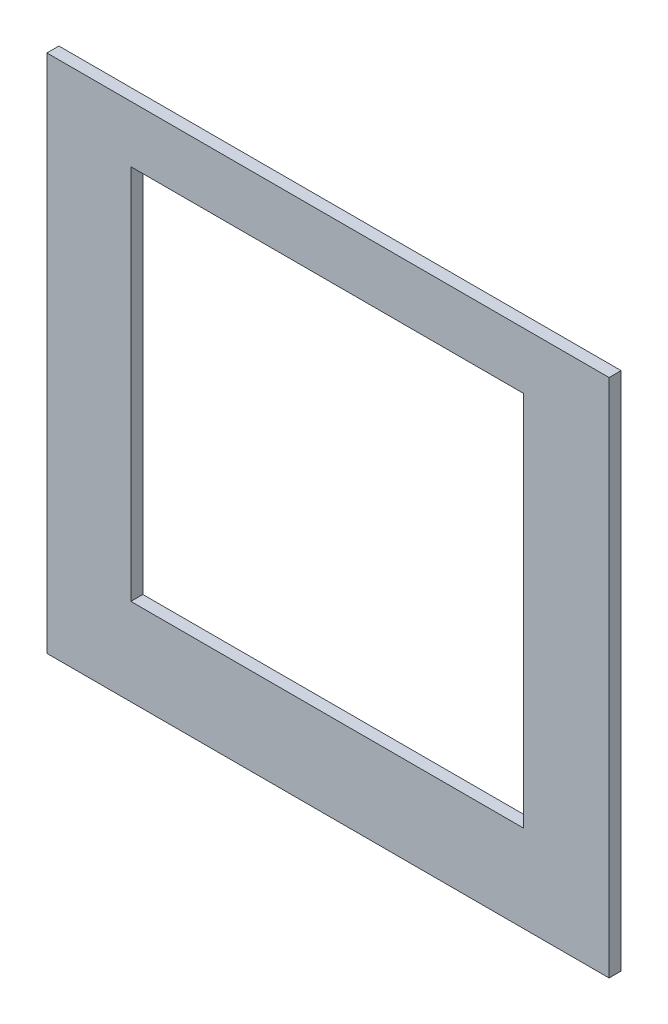
ISO-10303-21;
HEADER;
FILE_DESCRIPTION(('STEP AP214'),'2;1');
FILE_NAME('part.step','',(''),(''),'','','');
FILE_SCHEMA(('AUTOMOTIVE_DESIGN { 1 0 10303 214 1 1 1 1 }'));
ENDSEC;
DATA;
#1=APPLICATION_CONTEXT('core data for automotive mechanical design processes');
#2=APPLICATION_PROTOCOL_DEFINITION('international standard','automotive_design',2000,#1);
#3=PRODUCT_CONTEXT('',#1,'mechanical');
#4=PRODUCT('Part','Part','',(#3));
#5=PRODUCT_RELATED_PRODUCT_CATEGORY('part','',(#4));
#6=PRODUCT_DEFINITION_FORMATION('','',#4);
#7=PRODUCT_DEFINITION_CONTEXT('part definition',#1,'design');
#8=PRODUCT_DEFINITION('design','',#6,#7);
#9=PRODUCT_DEFINITION_SHAPE('','',#8);
#10=(LENGTH_UNIT() NAMED_UNIT(*) SI_UNIT(.MILLI.,.METRE.));
#11=(NAMED_UNIT(*) PLANE_ANGLE_UNIT() SI_UNIT($,.RADIAN.));
#12=(NAMED_UNIT(*) SI_UNIT($,.STERADIAN.) SOLID_ANGLE_UNIT());
#13=UNCERTAINTY_MEASURE_WITH_UNIT(LENGTH_MEASURE(1.E-05),#10,'distance_accuracy_value','');
#14=(GEOMETRIC_REPRESENTATION_CONTEXT(3) GLOBAL_UNCERTAINTY_ASSIGNED_CONTEXT((#13)) GLOBAL_UNIT_ASSIGNED_CONTEXT((#10,
#11,#12)) REPRESENTATION_CONTEXT('',''));
#15=CARTESIAN_POINT('',(0.,0.,0.));
#16=DIRECTION('',(0.,0.,1.));
#17=DIRECTION('',(1.,0.,0.));
#18=AXIS2_PLACEMENT_3D('',#15,#16,#17);
#19=CARTESIAN_POINT('',(0.,0.,19.05));
#20=DIRECTION('',(0.,0.,1.));
#21=DIRECTION('',(1.,0.,0.));
#22=AXIS2_PLACEMENT_3D('',#19,#20,#21);
#23=PLANE('',#22);
#24=DIRECTION('',(0.,-1.,0.));
#25=VECTOR('',#24,1.);
#26=CARTESIAN_POINT('',(1904.50560496076,2801.85767112072,19.05));
#27=LINE('',#26,#25);
#28=CARTESIAN_POINT('',(1904.50560496076,2801.85767112072,19.05));
#29=VERTEX_POINT('',#28);
#30=CARTESIAN_POINT('',(1904.50560496076,1976.35767112072,19.05));
#31=VERTEX_POINT('',#30);
#32=EDGE_CURVE('E134',#29,#31,#27,.T.);
#33=ORIENTED_EDGE('',*,*,#32,.T.);
#34=DIRECTION('',(1.,0.,0.));
#35=VECTOR('',#34,1.);
#36=CARTESIAN_POINT('',(1904.50560496076,1976.35767112072,19.05));
#37=LINE('',#36,#35);
#38=CARTESIAN_POINT('',(2796.96508496076,1976.35767112072,19.05));
#39=VERTEX_POINT('',#38);
#40=EDGE_CURVE('E137',#31,#39,#37,.T.);
#41=ORIENTED_EDGE('',*,*,#40,.T.);
#42=DIRECTION('',(0.,1.,0.));
#43=VECTOR('',#42,1.);
#44=CARTESIAN_POINT('',(2796.96508496076,1976.35767112072,19.05));
#45=LINE('',#44,#43);
#46=CARTESIAN_POINT('',(2796.96508496076,2801.85767112072,19.05));
#47=VERTEX_POINT('',#46);
#48=EDGE_CURVE('E140',#39,#47,#45,.T.);
#49=ORIENTED_EDGE('',*,*,#48,.T.);
#50=DIRECTION('',(-1.,0.,0.));
#51=VECTOR('',#50,1.);
#52=CARTESIAN_POINT('',(2796.96508496076,2801.85767112072,19.05));
#53=LINE('',#52,#51);
#54=EDGE_CURVE('E142',#47,#29,#53,.T.);
#55=ORIENTED_EDGE('',*,*,#54,.T.);
#56=EDGE_LOOP('',(#33,#41,#49,#55));
#57=FACE_BOUND('',#56,.T.);
#58=DIRECTION('',(1.,0.,0.));
#59=VECTOR('',#58,1.);
#60=CARTESIAN_POINT('',(2661.1781320158,2114.49307062371,19.05));
#61=LINE('',#60,#59);
#62=CARTESIAN_POINT('',(2037.74413485327,2114.49307062371,19.05));
#63=VERTEX_POINT('',#62);
#64=CARTESIAN_POINT('',(2661.1781320158,2114.49307062371,19.05));
#65=VERTEX_POINT('',#64);
#66=EDGE_CURVE('E106',#63,#65,#61,.T.);
#67=ORIENTED_EDGE('',*,*,#66,.F.);
#68=DIRECTION('',(0.,-1.,0.));
#69=VECTOR('',#68,1.);
#70=CARTESIAN_POINT('',(2037.74413485327,2114.49307062371,19.05));
#71=LINE('',#70,#69);
#72=CARTESIAN_POINT('',(2037.74413485327,2712.10024123284,19.05));
#73=VERTEX_POINT('',#72);
#74=EDGE_CURVE('E98',#73,#63,#71,.T.);
#75=ORIENTED_EDGE('',*,*,#74,.F.);
#76=DIRECTION('',(-1.,0.,0.));
#77=VECTOR('',#76,1.);
#78=CARTESIAN_POINT('',(2037.74413485327,2712.10024123284,19.05));
#79=LINE('',#78,#77);
#80=CARTESIAN_POINT('',(2661.1781320158,2712.10024123284,19.05));
#81=VERTEX_POINT('',#80);
#82=EDGE_CURVE('E120',#81,#73,#79,.T.);
#83=ORIENTED_EDGE('',*,*,#82,.F.);
#84=DIRECTION('',(0.,1.,0.));
#85=VECTOR('',#84,1.);
#86=CARTESIAN_POINT('',(2661.1781320158,2712.10024123284,19.05));
#87=LINE('',#86,#85);
#88=EDGE_CURVE('E118',#65,#81,#87,.T.);
#89=ORIENTED_EDGE('',*,*,#88,.F.);
#90=EDGE_LOOP('',(#67,#75,#83,#89));
#91=FACE_BOUND('',#90,.T.);
#92=ADVANCED_FACE('F33',(#57,#91),#23,.T.);
#93=CARTESIAN_POINT('',(0.,0.,0.));
#94=DIRECTION('',(0.,0.,1.));
#95=DIRECTION('',(1.,0.,0.));
#96=AXIS2_PLACEMENT_3D('',#93,#94,#95);
#97=PLANE('',#96);
#98=DIRECTION('',(0.,-1.,0.));
#99=VECTOR('',#98,1.);
#100=CARTESIAN_POINT('',(1904.50560496076,2801.85767112072,0.));
#101=LINE('',#100,#99);
#102=CARTESIAN_POINT('',(1904.50560496076,2801.85767112072,0.));
#103=VERTEX_POINT('',#102);
#104=CARTESIAN_POINT('',(1904.50560496076,1976.35767112072,0.));
#105=VERTEX_POINT('',#104);
#106=EDGE_CURVE('E114',#103,#105,#101,.T.);
#107=ORIENTED_EDGE('',*,*,#106,.F.);
#108=DIRECTION('',(-1.,0.,0.));
#109=VECTOR('',#108,1.);
#110=CARTESIAN_POINT('',(2796.96508496076,2801.85767112072,0.));
#111=LINE('',#110,#109);
#112=CARTESIAN_POINT('',(2796.96508496076,2801.85767112072,0.));
#113=VERTEX_POINT('',#112);
#114=EDGE_CURVE('E138',#113,#103,#111,.T.);
#115=ORIENTED_EDGE('',*,*,#114,.F.);
#116=DIRECTION('',(0.,1.,0.));
#117=VECTOR('',#116,1.);
#118=CARTESIAN_POINT('',(2796.96508496076,1976.35767112072,0.));
#119=LINE('',#118,#117);
#120=CARTESIAN_POINT('',(2796.96508496076,1976.35767112072,0.));
#121=VERTEX_POINT('',#120);
#122=EDGE_CURVE('E149',#121,#113,#119,.T.);
#123=ORIENTED_EDGE('',*,*,#122,.F.);
#124=DIRECTION('',(1.,0.,0.));
#125=VECTOR('',#124,1.);
#126=CARTESIAN_POINT('',(1904.50560496076,1976.35767112072,0.));
#127=LINE('',#126,#125);
#128=EDGE_CURVE('E147',#105,#121,#127,.T.);
#129=ORIENTED_EDGE('',*,*,#128,.F.);
#130=EDGE_LOOP('',(#107,#115,#123,#129));
#131=FACE_BOUND('',#130,.T.);
#132=DIRECTION('',(0.,-1.,0.));
#133=VECTOR('',#132,1.);
#134=CARTESIAN_POINT('',(2037.74413485327,2114.49307062371,0.));
#135=LINE('',#134,#133);
#136=CARTESIAN_POINT('',(2037.74413485327,2712.10024123284,0.));
#137=VERTEX_POINT('',#136);
#138=CARTESIAN_POINT('',(2037.74413485327,2114.49307062371,0.));
#139=VERTEX_POINT('',#138);
#140=EDGE_CURVE('E56',#137,#139,#135,.T.);
#141=ORIENTED_EDGE('',*,*,#140,.T.);
#142=DIRECTION('',(1.,0.,0.));
#143=VECTOR('',#142,1.);
#144=CARTESIAN_POINT('',(2661.1781320158,2114.49307062371,0.));
#145=LINE('',#144,#143);
#146=CARTESIAN_POINT('',(2661.1781320158,2114.49307062371,0.));
#147=VERTEX_POINT('',#146);
#148=EDGE_CURVE('E113',#139,#147,#145,.T.);
#149=ORIENTED_EDGE('',*,*,#148,.T.);
#150=DIRECTION('',(0.,1.,0.));
#151=VECTOR('',#150,1.);
#152=CARTESIAN_POINT('',(2661.1781320158,2712.10024123284,0.));
#153=LINE('',#152,#151);
#154=CARTESIAN_POINT('',(2661.1781320158,2712.10024123284,0.));
#155=VERTEX_POINT('',#154);
#156=EDGE_CURVE('E126',#147,#155,#153,.T.);
#157=ORIENTED_EDGE('',*,*,#156,.T.);
#158=DIRECTION('',(-1.,0.,0.));
#159=VECTOR('',#158,1.);
#160=CARTESIAN_POINT('',(2037.74413485327,2712.10024123284,0.));
#161=LINE('',#160,#159);
#162=EDGE_CURVE('E107',#155,#137,#161,.T.);
#163=ORIENTED_EDGE('',*,*,#162,.T.);
#164=EDGE_LOOP('',(#141,#149,#157,#163));
#165=FACE_BOUND('',#164,.T.);
#166=ADVANCED_FACE('F167',(#131,#165),#97,.F.);
#167=CARTESIAN_POINT('',(1904.50560496076,2801.85767112072,19.05));
#168=DIRECTION('',(1.,0.,0.));
#169=DIRECTION('',(0.,0.,-1.));
#170=AXIS2_PLACEMENT_3D('',#167,#168,#169);
#171=PLANE('',#170);
#172=ORIENTED_EDGE('',*,*,#106,.T.);
#173=DIRECTION('',(0.,0.,-1.));
#174=VECTOR('',#173,1.);
#175=CARTESIAN_POINT('',(1904.50560496076,1976.35767112072,19.05));
#176=LINE('',#175,#174);
#177=EDGE_CURVE('E11',#31,#105,#176,.T.);
#178=ORIENTED_EDGE('',*,*,#177,.F.);
#179=ORIENTED_EDGE('',*,*,#32,.F.);
#180=DIRECTION('',(0.,0.,-1.));
#181=VECTOR('',#180,1.);
#182=CARTESIAN_POINT('',(1904.50560496076,2801.85767112072,19.05));
#183=LINE('',#182,#181);
#184=EDGE_CURVE('E144',#29,#103,#183,.T.);
#185=ORIENTED_EDGE('',*,*,#184,.T.);
#186=EDGE_LOOP('',(#172,#178,#179,#185));
#187=FACE_BOUND('',#186,.T.);
#188=ADVANCED_FACE('F35',(#187),#171,.F.);
#189=CARTESIAN_POINT('',(1904.50560496076,1976.35767112072,19.05));
#190=DIRECTION('',(0.,1.,0.));
#191=DIRECTION('',(0.,0.,1.));
#192=AXIS2_PLACEMENT_3D('',#189,#190,#191);
#193=PLANE('',#192);
#194=ORIENTED_EDGE('',*,*,#128,.T.);
#195=DIRECTION('',(0.,0.,-1.));
#196=VECTOR('',#195,1.);
#197=CARTESIAN_POINT('',(2796.96508496076,1976.35767112072,19.05));
#198=LINE('',#197,#196);
#199=EDGE_CURVE('E41',#39,#121,#198,.T.);
#200=ORIENTED_EDGE('',*,*,#199,.F.);
#201=ORIENTED_EDGE('',*,*,#40,.F.);
#202=ORIENTED_EDGE('',*,*,#177,.T.);
#203=EDGE_LOOP('',(#194,#200,#201,#202));
#204=FACE_BOUND('',#203,.T.);
#205=ADVANCED_FACE('F177',(#204),#193,.F.);
#206=CARTESIAN_POINT('',(2796.96508496076,1976.35767112072,19.05));
#207=DIRECTION('',(-1.,0.,0.));
#208=DIRECTION('',(0.,0.,1.));
#209=AXIS2_PLACEMENT_3D('',#206,#207,#208);
#210=PLANE('',#209);
#211=ORIENTED_EDGE('',*,*,#122,.T.);
#212=DIRECTION('',(0.,0.,-1.));
#213=VECTOR('',#212,1.);
#214=CARTESIAN_POINT('',(2796.96508496076,2801.85767112072,19.05));
#215=LINE('',#214,#213);
#216=EDGE_CURVE('E154',#47,#113,#215,.T.);
#217=ORIENTED_EDGE('',*,*,#216,.F.);
#218=ORIENTED_EDGE('',*,*,#48,.F.);
#219=ORIENTED_EDGE('',*,*,#199,.T.);
#220=EDGE_LOOP('',(#211,#217,#218,#219));
#221=FACE_BOUND('',#220,.T.);
#222=ADVANCED_FACE('F161',(#221),#210,.F.);
#223=CARTESIAN_POINT('',(2796.96508496076,2801.85767112072,19.05));
#224=DIRECTION('',(0.,-1.,0.));
#225=DIRECTION('',(0.,0.,-1.));
#226=AXIS2_PLACEMENT_3D('',#223,#224,#225);
#227=PLANE('',#226);
#228=ORIENTED_EDGE('',*,*,#114,.T.);
#229=ORIENTED_EDGE('',*,*,#184,.F.);
#230=ORIENTED_EDGE('',*,*,#54,.F.);
#231=ORIENTED_EDGE('',*,*,#216,.T.);
#232=EDGE_LOOP('',(#228,#229,#230,#231));
#233=FACE_BOUND('',#232,.T.);
#234=ADVANCED_FACE('F171',(#233),#227,.F.);
#235=CARTESIAN_POINT('',(2037.74413485327,2114.49307062371,19.05));
#236=DIRECTION('',(1.,0.,0.));
#237=DIRECTION('',(0.,0.,-1.));
#238=AXIS2_PLACEMENT_3D('',#235,#236,#237);
#239=PLANE('',#238);
#240=ORIENTED_EDGE('',*,*,#140,.F.);
#241=DIRECTION('',(0.,0.,-1.));
#242=VECTOR('',#241,1.);
#243=CARTESIAN_POINT('',(2037.74413485327,2712.10024123284,19.05));
#244=LINE('',#243,#242);
#245=EDGE_CURVE('E102',#73,#137,#244,.T.);
#246=ORIENTED_EDGE('',*,*,#245,.F.);
#247=ORIENTED_EDGE('',*,*,#74,.T.);
#248=DIRECTION('',(0.,0.,-1.));
#249=VECTOR('',#248,1.);
#250=CARTESIAN_POINT('',(2037.74413485327,2114.49307062371,19.05));
#251=LINE('',#250,#249);
#252=EDGE_CURVE('E101',#63,#139,#251,.T.);
#253=ORIENTED_EDGE('',*,*,#252,.T.);
#254=EDGE_LOOP('',(#240,#246,#247,#253));
#255=FACE_BOUND('',#254,.T.);
#256=ADVANCED_FACE('F100',(#255),#239,.T.);
#257=CARTESIAN_POINT('',(2661.1781320158,2114.49307062371,19.05));
#258=DIRECTION('',(0.,1.,0.));
#259=DIRECTION('',(0.,0.,1.));
#260=AXIS2_PLACEMENT_3D('',#257,#258,#259);
#261=PLANE('',#260);
#262=ORIENTED_EDGE('',*,*,#148,.F.);
#263=ORIENTED_EDGE('',*,*,#252,.F.);
#264=ORIENTED_EDGE('',*,*,#66,.T.);
#265=DIRECTION('',(0.,0.,-1.));
#266=VECTOR('',#265,1.);
#267=CARTESIAN_POINT('',(2661.1781320158,2114.49307062371,19.05));
#268=LINE('',#267,#266);
#269=EDGE_CURVE('E115',#65,#147,#268,.T.);
#270=ORIENTED_EDGE('',*,*,#269,.T.);
#271=EDGE_LOOP('',(#262,#263,#264,#270));
#272=FACE_BOUND('',#271,.T.);
#273=ADVANCED_FACE('F110',(#272),#261,.T.);
#274=CARTESIAN_POINT('',(2661.1781320158,2712.10024123284,19.05));
#275=DIRECTION('',(-1.,0.,0.));
#276=DIRECTION('',(0.,0.,1.));
#277=AXIS2_PLACEMENT_3D('',#274,#275,#276);
#278=PLANE('',#277);
#279=ORIENTED_EDGE('',*,*,#156,.F.);
#280=ORIENTED_EDGE('',*,*,#269,.F.);
#281=ORIENTED_EDGE('',*,*,#88,.T.);
#282=DIRECTION('',(0.,0.,-1.));
#283=VECTOR('',#282,1.);
#284=CARTESIAN_POINT('',(2661.1781320158,2712.10024123284,19.05));
#285=LINE('',#284,#283);
#286=EDGE_CURVE('E48',#81,#155,#285,.T.);
#287=ORIENTED_EDGE('',*,*,#286,.T.);
#288=EDGE_LOOP('',(#279,#280,#281,#287));
#289=FACE_BOUND('',#288,.T.);
#290=ADVANCED_FACE('F200',(#289),#278,.T.);
#291=CARTESIAN_POINT('',(2037.74413485327,2712.10024123284,19.05));
#292=DIRECTION('',(0.,-1.,0.));
#293=DIRECTION('',(0.,0.,-1.));
#294=AXIS2_PLACEMENT_3D('',#291,#292,#293);
#295=PLANE('',#294);
#296=ORIENTED_EDGE('',*,*,#162,.F.);
#297=ORIENTED_EDGE('',*,*,#286,.F.);
#298=ORIENTED_EDGE('',*,*,#82,.T.);
#299=ORIENTED_EDGE('',*,*,#245,.T.);
#300=EDGE_LOOP('',(#296,#297,#298,#299));
#301=FACE_BOUND('',#300,.T.);
#302=ADVANCED_FACE('F204',(#301),#295,.T.);
#303=CLOSED_SHELL('',(#92,#166,#188,#205,#222,#234,#256,#273,#290,#302));
#304=MANIFOLD_SOLID_BREP('B2',#303);
#305=ADVANCED_BREP_SHAPE_REPRESENTATION('',(#18,#304),#14);
#306=SHAPE_DEFINITION_REPRESENTATION(#9,#305);
ENDSEC;
END-ISO-10303-21;
